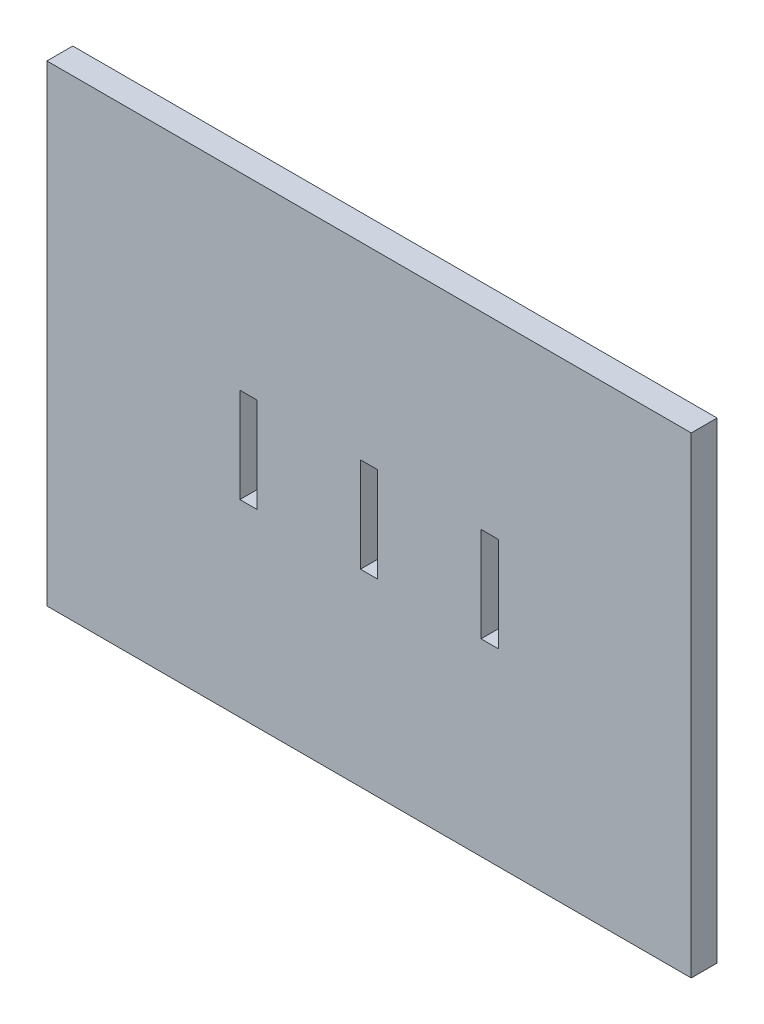
ISO-10303-21;
HEADER;
FILE_DESCRIPTION(('STEP AP214'),'2;1');
FILE_NAME('part.step','',(''),(''),'','','');
FILE_SCHEMA(('AUTOMOTIVE_DESIGN { 1 0 10303 214 1 1 1 1 }'));
ENDSEC;
DATA;
#1=APPLICATION_CONTEXT('core data for automotive mechanical design processes');
#2=APPLICATION_PROTOCOL_DEFINITION('international standard','automotive_design',2000,#1);
#3=PRODUCT_CONTEXT('',#1,'mechanical');
#4=PRODUCT('Part','Part','',(#3));
#5=PRODUCT_RELATED_PRODUCT_CATEGORY('part','',(#4));
#6=PRODUCT_DEFINITION_FORMATION('','',#4);
#7=PRODUCT_DEFINITION_CONTEXT('part definition',#1,'design');
#8=PRODUCT_DEFINITION('design','',#6,#7);
#9=PRODUCT_DEFINITION_SHAPE('','',#8);
#10=(LENGTH_UNIT() NAMED_UNIT(*) SI_UNIT(.MILLI.,.METRE.));
#11=(NAMED_UNIT(*) PLANE_ANGLE_UNIT() SI_UNIT($,.RADIAN.));
#12=(NAMED_UNIT(*) SI_UNIT($,.STERADIAN.) SOLID_ANGLE_UNIT());
#13=UNCERTAINTY_MEASURE_WITH_UNIT(LENGTH_MEASURE(1.E-05),#10,'distance_accuracy_value','');
#14=(GEOMETRIC_REPRESENTATION_CONTEXT(3) GLOBAL_UNCERTAINTY_ASSIGNED_CONTEXT((#13)) GLOBAL_UNIT_ASSIGNED_CONTEXT((#10,
#11,#12)) REPRESENTATION_CONTEXT('',''));
#15=CARTESIAN_POINT('',(0.,0.,0.));
#16=DIRECTION('',(0.,0.,1.));
#17=DIRECTION('',(1.,0.,0.));
#18=AXIS2_PLACEMENT_3D('',#15,#16,#17);
#19=CARTESIAN_POINT('',(7.50000000000001,0.,1.5));
#20=DIRECTION('',(-1.,0.,0.));
#21=DIRECTION('',(0.,0.,1.));
#22=AXIS2_PLACEMENT_3D('',#19,#20,#21);
#23=PLANE('',#22);
#24=DIRECTION('',(0.,1.,0.));
#25=VECTOR('',#24,1.);
#26=CARTESIAN_POINT('',(7.50000000000001,0.,0.));
#27=LINE('',#26,#25);
#28=CARTESIAN_POINT('',(7.50000000000001,-2.75,0.));
#29=VERTEX_POINT('',#28);
#30=CARTESIAN_POINT('',(7.50000000000001,2.75,0.));
#31=VERTEX_POINT('',#30);
#32=EDGE_CURVE('E258',#29,#31,#27,.T.);
#33=ORIENTED_EDGE('',*,*,#32,.F.);
#34=DIRECTION('',(0.,0.,-1.));
#35=VECTOR('',#34,1.);
#36=CARTESIAN_POINT('',(7.50000000000001,-2.75,1.5));
#37=LINE('',#36,#35);
#38=CARTESIAN_POINT('',(7.50000000000001,-2.75,1.5));
#39=VERTEX_POINT('',#38);
#40=EDGE_CURVE('E11',#39,#29,#37,.T.);
#41=ORIENTED_EDGE('',*,*,#40,.F.);
#42=DIRECTION('',(0.,1.,0.));
#43=VECTOR('',#42,1.);
#44=CARTESIAN_POINT('',(7.50000000000001,0.,1.5));
#45=LINE('',#44,#43);
#46=CARTESIAN_POINT('',(7.50000000000001,2.75,1.5));
#47=VERTEX_POINT('',#46);
#48=EDGE_CURVE('E174',#39,#47,#45,.T.);
#49=ORIENTED_EDGE('',*,*,#48,.T.);
#50=DIRECTION('',(0.,0.,-1.));
#51=VECTOR('',#50,1.);
#52=CARTESIAN_POINT('',(7.50000000000001,2.75,1.5));
#53=LINE('',#52,#51);
#54=EDGE_CURVE('E60',#47,#31,#53,.T.);
#55=ORIENTED_EDGE('',*,*,#54,.T.);
#56=EDGE_LOOP('',(#33,#41,#49,#55));
#57=FACE_BOUND('',#56,.T.);
#58=ADVANCED_FACE('F41',(#57),#23,.T.);
#59=CARTESIAN_POINT('',(0.,-2.75,1.5));
#60=DIRECTION('',(0.,-1.,0.));
#61=DIRECTION('',(0.,0.,-1.));
#62=AXIS2_PLACEMENT_3D('',#59,#60,#61);
#63=PLANE('',#62);
#64=DIRECTION('',(-1.,0.,0.));
#65=VECTOR('',#64,1.);
#66=CARTESIAN_POINT('',(0.,-2.75,0.));
#67=LINE('',#66,#65);
#68=CARTESIAN_POINT('',(6.50000000000001,-2.75,0.));
#69=VERTEX_POINT('',#68);
#70=EDGE_CURVE('E179',#29,#69,#67,.T.);
#71=ORIENTED_EDGE('',*,*,#70,.T.);
#72=DIRECTION('',(0.,0.,-1.));
#73=VECTOR('',#72,1.);
#74=CARTESIAN_POINT('',(6.50000000000001,-2.75,1.5));
#75=LINE('',#74,#73);
#76=CARTESIAN_POINT('',(6.50000000000001,-2.75,1.5));
#77=VERTEX_POINT('',#76);
#78=EDGE_CURVE('E51',#77,#69,#75,.T.);
#79=ORIENTED_EDGE('',*,*,#78,.F.);
#80=DIRECTION('',(-1.,0.,0.));
#81=VECTOR('',#80,1.);
#82=CARTESIAN_POINT('',(0.,-2.75,1.5));
#83=LINE('',#82,#81);
#84=EDGE_CURVE('E169',#39,#77,#83,.T.);
#85=ORIENTED_EDGE('',*,*,#84,.F.);
#86=ORIENTED_EDGE('',*,*,#40,.T.);
#87=EDGE_LOOP('',(#71,#79,#85,#86));
#88=FACE_BOUND('',#87,.T.);
#89=ADVANCED_FACE('F177',(#88),#63,.F.);
#90=CARTESIAN_POINT('',(6.50000000000001,0.,1.5));
#91=DIRECTION('',(-1.,0.,0.));
#92=DIRECTION('',(0.,0.,1.));
#93=AXIS2_PLACEMENT_3D('',#90,#91,#92);
#94=PLANE('',#93);
#95=DIRECTION('',(0.,1.,0.));
#96=VECTOR('',#95,1.);
#97=CARTESIAN_POINT('',(6.50000000000001,0.,0.));
#98=LINE('',#97,#96);
#99=CARTESIAN_POINT('',(6.50000000000001,2.75,0.));
#100=VERTEX_POINT('',#99);
#101=EDGE_CURVE('E261',#69,#100,#98,.T.);
#102=ORIENTED_EDGE('',*,*,#101,.T.);
#103=DIRECTION('',(0.,0.,-1.));
#104=VECTOR('',#103,1.);
#105=CARTESIAN_POINT('',(6.50000000000001,2.75,1.5));
#106=LINE('',#105,#104);
#107=CARTESIAN_POINT('',(6.50000000000001,2.75,1.5));
#108=VERTEX_POINT('',#107);
#109=EDGE_CURVE('E110',#108,#100,#106,.T.);
#110=ORIENTED_EDGE('',*,*,#109,.F.);
#111=DIRECTION('',(0.,1.,0.));
#112=VECTOR('',#111,1.);
#113=CARTESIAN_POINT('',(6.50000000000001,0.,1.5));
#114=LINE('',#113,#112);
#115=EDGE_CURVE('E161',#77,#108,#114,.T.);
#116=ORIENTED_EDGE('',*,*,#115,.F.);
#117=ORIENTED_EDGE('',*,*,#78,.T.);
#118=EDGE_LOOP('',(#102,#110,#116,#117));
#119=FACE_BOUND('',#118,.T.);
#120=ADVANCED_FACE('F163',(#119),#94,.F.);
#121=CARTESIAN_POINT('',(-6.49999999999999,0.,1.5));
#122=DIRECTION('',(-1.,0.,0.));
#123=DIRECTION('',(0.,0.,1.));
#124=AXIS2_PLACEMENT_3D('',#121,#122,#123);
#125=PLANE('',#124);
#126=DIRECTION('',(0.,1.,0.));
#127=VECTOR('',#126,1.);
#128=CARTESIAN_POINT('',(-6.49999999999999,0.,0.));
#129=LINE('',#128,#127);
#130=CARTESIAN_POINT('',(-6.49999999999999,-2.75,0.));
#131=VERTEX_POINT('',#130);
#132=CARTESIAN_POINT('',(-6.49999999999999,2.75,0.));
#133=VERTEX_POINT('',#132);
#134=EDGE_CURVE('E246',#131,#133,#129,.T.);
#135=ORIENTED_EDGE('',*,*,#134,.F.);
#136=DIRECTION('',(0.,0.,-1.));
#137=VECTOR('',#136,1.);
#138=CARTESIAN_POINT('',(-6.49999999999999,-2.75,1.5));
#139=LINE('',#138,#137);
#140=CARTESIAN_POINT('',(-6.49999999999999,-2.75,1.5));
#141=VERTEX_POINT('',#140);
#142=EDGE_CURVE('E192',#141,#131,#139,.T.);
#143=ORIENTED_EDGE('',*,*,#142,.F.);
#144=DIRECTION('',(0.,1.,0.));
#145=VECTOR('',#144,1.);
#146=CARTESIAN_POINT('',(-6.49999999999999,0.,1.5));
#147=LINE('',#146,#145);
#148=CARTESIAN_POINT('',(-6.49999999999999,2.75,1.5));
#149=VERTEX_POINT('',#148);
#150=EDGE_CURVE('E285',#141,#149,#147,.T.);
#151=ORIENTED_EDGE('',*,*,#150,.T.);
#152=DIRECTION('',(0.,0.,-1.));
#153=VECTOR('',#152,1.);
#154=CARTESIAN_POINT('',(-6.49999999999999,2.75,1.5));
#155=LINE('',#154,#153);
#156=EDGE_CURVE('E184',#149,#133,#155,.T.);
#157=ORIENTED_EDGE('',*,*,#156,.T.);
#158=EDGE_LOOP('',(#135,#143,#151,#157));
#159=FACE_BOUND('',#158,.T.);
#160=ADVANCED_FACE('F331',(#159),#125,.T.);
#161=CARTESIAN_POINT('',(0.,-2.75,1.5));
#162=DIRECTION('',(0.,-1.,0.));
#163=DIRECTION('',(0.,0.,-1.));
#164=AXIS2_PLACEMENT_3D('',#161,#162,#163);
#165=PLANE('',#164);
#166=DIRECTION('',(-1.,0.,0.));
#167=VECTOR('',#166,1.);
#168=CARTESIAN_POINT('',(0.,-2.75,0.));
#169=LINE('',#168,#167);
#170=CARTESIAN_POINT('',(-7.49999999999999,-2.75,0.));
#171=VERTEX_POINT('',#170);
#172=EDGE_CURVE('E249',#131,#171,#169,.T.);
#173=ORIENTED_EDGE('',*,*,#172,.T.);
#174=DIRECTION('',(0.,0.,-1.));
#175=VECTOR('',#174,1.);
#176=CARTESIAN_POINT('',(-7.49999999999999,-2.75,1.5));
#177=LINE('',#176,#175);
#178=CARTESIAN_POINT('',(-7.49999999999999,-2.75,1.5));
#179=VERTEX_POINT('',#178);
#180=EDGE_CURVE('E189',#179,#171,#177,.T.);
#181=ORIENTED_EDGE('',*,*,#180,.F.);
#182=DIRECTION('',(-1.,0.,0.));
#183=VECTOR('',#182,1.);
#184=CARTESIAN_POINT('',(0.,-2.75,1.5));
#185=LINE('',#184,#183);
#186=EDGE_CURVE('E288',#141,#179,#185,.T.);
#187=ORIENTED_EDGE('',*,*,#186,.F.);
#188=ORIENTED_EDGE('',*,*,#142,.T.);
#189=EDGE_LOOP('',(#173,#181,#187,#188));
#190=FACE_BOUND('',#189,.T.);
#191=ADVANCED_FACE('F327',(#190),#165,.F.);
#192=CARTESIAN_POINT('',(-7.49999999999999,0.,1.5));
#193=DIRECTION('',(-1.,0.,0.));
#194=DIRECTION('',(0.,0.,1.));
#195=AXIS2_PLACEMENT_3D('',#192,#193,#194);
#196=PLANE('',#195);
#197=DIRECTION('',(0.,1.,0.));
#198=VECTOR('',#197,1.);
#199=CARTESIAN_POINT('',(-7.49999999999999,0.,0.));
#200=LINE('',#199,#198);
#201=CARTESIAN_POINT('',(-7.49999999999999,2.75,0.));
#202=VERTEX_POINT('',#201);
#203=EDGE_CURVE('E252',#171,#202,#200,.T.);
#204=ORIENTED_EDGE('',*,*,#203,.T.);
#205=DIRECTION('',(0.,0.,-1.));
#206=VECTOR('',#205,1.);
#207=CARTESIAN_POINT('',(-7.49999999999999,2.75,1.5));
#208=LINE('',#207,#206);
#209=CARTESIAN_POINT('',(-7.49999999999999,2.75,1.5));
#210=VERTEX_POINT('',#209);
#211=EDGE_CURVE('E186',#210,#202,#208,.T.);
#212=ORIENTED_EDGE('',*,*,#211,.F.);
#213=DIRECTION('',(0.,1.,0.));
#214=VECTOR('',#213,1.);
#215=CARTESIAN_POINT('',(-7.49999999999999,0.,1.5));
#216=LINE('',#215,#214);
#217=EDGE_CURVE('E291',#179,#210,#216,.T.);
#218=ORIENTED_EDGE('',*,*,#217,.F.);
#219=ORIENTED_EDGE('',*,*,#180,.T.);
#220=EDGE_LOOP('',(#204,#212,#218,#219));
#221=FACE_BOUND('',#220,.T.);
#222=ADVANCED_FACE('F323',(#221),#196,.F.);
#223=CARTESIAN_POINT('',(0.,-13.7,1.5));
#224=DIRECTION('',(0.,-1.,0.));
#225=DIRECTION('',(0.,0.,-1.));
#226=AXIS2_PLACEMENT_3D('',#223,#224,#225);
#227=PLANE('',#226);
#228=DIRECTION('',(-1.,0.,0.));
#229=VECTOR('',#228,1.);
#230=CARTESIAN_POINT('',(0.,-13.7,0.));
#231=LINE('',#230,#229);
#232=CARTESIAN_POINT('',(18.7,-13.7,0.));
#233=VERTEX_POINT('',#232);
#234=CARTESIAN_POINT('',(-18.7,-13.7,0.));
#235=VERTEX_POINT('',#234);
#236=EDGE_CURVE('E234',#233,#235,#231,.T.);
#237=ORIENTED_EDGE('',*,*,#236,.F.);
#238=DIRECTION('',(0.,0.,-1.));
#239=VECTOR('',#238,1.);
#240=CARTESIAN_POINT('',(18.7,-13.7,1.5));
#241=LINE('',#240,#239);
#242=CARTESIAN_POINT('',(18.7,-13.7,1.5));
#243=VERTEX_POINT('',#242);
#244=EDGE_CURVE('E187',#243,#233,#241,.T.);
#245=ORIENTED_EDGE('',*,*,#244,.F.);
#246=DIRECTION('',(-1.,0.,0.));
#247=VECTOR('',#246,1.);
#248=CARTESIAN_POINT('',(0.,-13.7,1.5));
#249=LINE('',#248,#247);
#250=CARTESIAN_POINT('',(-18.7,-13.7,1.5));
#251=VERTEX_POINT('',#250);
#252=EDGE_CURVE('E274',#243,#251,#249,.T.);
#253=ORIENTED_EDGE('',*,*,#252,.T.);
#254=DIRECTION('',(0.,0.,-1.));
#255=VECTOR('',#254,1.);
#256=CARTESIAN_POINT('',(-18.7,-13.7,1.5));
#257=LINE('',#256,#255);
#258=EDGE_CURVE('E194',#251,#235,#257,.T.);
#259=ORIENTED_EDGE('',*,*,#258,.T.);
#260=EDGE_LOOP('',(#237,#245,#253,#259));
#261=FACE_BOUND('',#260,.T.);
#262=ADVANCED_FACE('F326',(#261),#227,.T.);
#263=CARTESIAN_POINT('',(18.7,0.,1.5));
#264=DIRECTION('',(-1.,0.,0.));
#265=DIRECTION('',(0.,0.,1.));
#266=AXIS2_PLACEMENT_3D('',#263,#264,#265);
#267=PLANE('',#266);
#268=DIRECTION('',(0.,1.,0.));
#269=VECTOR('',#268,1.);
#270=CARTESIAN_POINT('',(18.7,0.,0.));
#271=LINE('',#270,#269);
#272=CARTESIAN_POINT('',(18.7,13.7,0.));
#273=VERTEX_POINT('',#272);
#274=EDGE_CURVE('E237',#233,#273,#271,.T.);
#275=ORIENTED_EDGE('',*,*,#274,.T.);
#276=DIRECTION('',(0.,0.,-1.));
#277=VECTOR('',#276,1.);
#278=CARTESIAN_POINT('',(18.7,13.7,1.5));
#279=LINE('',#278,#277);
#280=CARTESIAN_POINT('',(18.7,13.7,1.5));
#281=VERTEX_POINT('',#280);
#282=EDGE_CURVE('E198',#281,#273,#279,.T.);
#283=ORIENTED_EDGE('',*,*,#282,.F.);
#284=DIRECTION('',(0.,1.,0.));
#285=VECTOR('',#284,1.);
#286=CARTESIAN_POINT('',(18.7,0.,1.5));
#287=LINE('',#286,#285);
#288=EDGE_CURVE('E277',#243,#281,#287,.T.);
#289=ORIENTED_EDGE('',*,*,#288,.F.);
#290=ORIENTED_EDGE('',*,*,#244,.T.);
#291=EDGE_LOOP('',(#275,#283,#289,#290));
#292=FACE_BOUND('',#291,.T.);
#293=ADVANCED_FACE('F342',(#292),#267,.F.);
#294=CARTESIAN_POINT('',(0.,13.7,1.5));
#295=DIRECTION('',(0.,-1.,0.));
#296=DIRECTION('',(0.,0.,-1.));
#297=AXIS2_PLACEMENT_3D('',#294,#295,#296);
#298=PLANE('',#297);
#299=DIRECTION('',(-1.,0.,0.));
#300=VECTOR('',#299,1.);
#301=CARTESIAN_POINT('',(0.,13.7,0.));
#302=LINE('',#301,#300);
#303=CARTESIAN_POINT('',(-18.7,13.7,0.));
#304=VERTEX_POINT('',#303);
#305=EDGE_CURVE('E240',#273,#304,#302,.T.);
#306=ORIENTED_EDGE('',*,*,#305,.T.);
#307=DIRECTION('',(0.,0.,-1.));
#308=VECTOR('',#307,1.);
#309=CARTESIAN_POINT('',(-18.7,13.7,1.5));
#310=LINE('',#309,#308);
#311=CARTESIAN_POINT('',(-18.7,13.7,1.5));
#312=VERTEX_POINT('',#311);
#313=EDGE_CURVE('E196',#312,#304,#310,.T.);
#314=ORIENTED_EDGE('',*,*,#313,.F.);
#315=DIRECTION('',(-1.,0.,0.));
#316=VECTOR('',#315,1.);
#317=CARTESIAN_POINT('',(0.,13.7,1.5));
#318=LINE('',#317,#316);
#319=EDGE_CURVE('E280',#281,#312,#318,.T.);
#320=ORIENTED_EDGE('',*,*,#319,.F.);
#321=ORIENTED_EDGE('',*,*,#282,.T.);
#322=EDGE_LOOP('',(#306,#314,#320,#321));
#323=FACE_BOUND('',#322,.T.);
#324=ADVANCED_FACE('F339',(#323),#298,.F.);
#325=CARTESIAN_POINT('',(0.,2.75,1.5));
#326=DIRECTION('',(0.,-1.,0.));
#327=DIRECTION('',(0.,0.,-1.));
#328=AXIS2_PLACEMENT_3D('',#325,#326,#327);
#329=PLANE('',#328);
#330=DIRECTION('',(-1.,0.,0.));
#331=VECTOR('',#330,1.);
#332=CARTESIAN_POINT('',(0.,2.75,0.));
#333=LINE('',#332,#331);
#334=CARTESIAN_POINT('',(0.500000000000007,2.75,0.));
#335=VERTEX_POINT('',#334);
#336=CARTESIAN_POINT('',(-0.499999999999993,2.75,0.));
#337=VERTEX_POINT('',#336);
#338=EDGE_CURVE('E219',#335,#337,#333,.T.);
#339=ORIENTED_EDGE('',*,*,#338,.F.);
#340=DIRECTION('',(0.,0.,-1.));
#341=VECTOR('',#340,1.);
#342=CARTESIAN_POINT('',(0.500000000000007,2.75,1.5));
#343=LINE('',#342,#341);
#344=CARTESIAN_POINT('',(0.500000000000007,2.75,1.5));
#345=VERTEX_POINT('',#344);
#346=EDGE_CURVE('E45',#345,#335,#343,.T.);
#347=ORIENTED_EDGE('',*,*,#346,.F.);
#348=DIRECTION('',(-1.,0.,0.));
#349=VECTOR('',#348,1.);
#350=CARTESIAN_POINT('',(0.,2.75,1.5));
#351=LINE('',#350,#349);
#352=CARTESIAN_POINT('',(-0.499999999999993,2.75,1.5));
#353=VERTEX_POINT('',#352);
#354=EDGE_CURVE('E265',#345,#353,#351,.T.);
#355=ORIENTED_EDGE('',*,*,#354,.T.);
#356=DIRECTION('',(0.,0.,-1.));
#357=VECTOR('',#356,1.);
#358=CARTESIAN_POINT('',(-0.499999999999993,2.75,1.5));
#359=LINE('',#358,#357);
#360=EDGE_CURVE('E202',#353,#337,#359,.T.);
#361=ORIENTED_EDGE('',*,*,#360,.T.);
#362=EDGE_LOOP('',(#339,#347,#355,#361));
#363=FACE_BOUND('',#362,.T.);
#364=ADVANCED_FACE('F43',(#363),#329,.T.);
#365=CARTESIAN_POINT('',(0.500000000000007,0.,1.5));
#366=DIRECTION('',(-1.,0.,0.));
#367=DIRECTION('',(0.,0.,1.));
#368=AXIS2_PLACEMENT_3D('',#365,#366,#367);
#369=PLANE('',#368);
#370=DIRECTION('',(0.,1.,0.));
#371=VECTOR('',#370,1.);
#372=CARTESIAN_POINT('',(0.500000000000007,0.,0.));
#373=LINE('',#372,#371);
#374=CARTESIAN_POINT('',(0.500000000000007,-2.75,0.));
#375=VERTEX_POINT('',#374);
#376=EDGE_CURVE('E215',#375,#335,#373,.T.);
#377=ORIENTED_EDGE('',*,*,#376,.F.);
#378=DIRECTION('',(0.,0.,-1.));
#379=VECTOR('',#378,1.);
#380=CARTESIAN_POINT('',(0.500000000000007,-2.75,1.5));
#381=LINE('',#380,#379);
#382=CARTESIAN_POINT('',(0.500000000000007,-2.75,1.5));
#383=VERTEX_POINT('',#382);
#384=EDGE_CURVE('E206',#383,#375,#381,.T.);
#385=ORIENTED_EDGE('',*,*,#384,.F.);
#386=DIRECTION('',(0.,1.,0.));
#387=VECTOR('',#386,1.);
#388=CARTESIAN_POINT('',(0.500000000000007,0.,1.5));
#389=LINE('',#388,#387);
#390=EDGE_CURVE('E217',#383,#345,#389,.T.);
#391=ORIENTED_EDGE('',*,*,#390,.T.);
#392=ORIENTED_EDGE('',*,*,#346,.T.);
#393=EDGE_LOOP('',(#377,#385,#391,#392));
#394=FACE_BOUND('',#393,.T.);
#395=ADVANCED_FACE('F213',(#394),#369,.T.);
#396=CARTESIAN_POINT('',(0.,-2.75,1.5));
#397=DIRECTION('',(0.,-1.,0.));
#398=DIRECTION('',(0.,0.,-1.));
#399=AXIS2_PLACEMENT_3D('',#396,#397,#398);
#400=PLANE('',#399);
#401=DIRECTION('',(-1.,0.,0.));
#402=VECTOR('',#401,1.);
#403=CARTESIAN_POINT('',(0.,-2.75,0.));
#404=LINE('',#403,#402);
#405=CARTESIAN_POINT('',(-0.499999999999993,-2.75,0.));
#406=VERTEX_POINT('',#405);
#407=EDGE_CURVE('E227',#375,#406,#404,.T.);
#408=ORIENTED_EDGE('',*,*,#407,.T.);
#409=DIRECTION('',(0.,0.,-1.));
#410=VECTOR('',#409,1.);
#411=CARTESIAN_POINT('',(-0.499999999999993,-2.75,1.5));
#412=LINE('',#411,#410);
#413=CARTESIAN_POINT('',(-0.499999999999993,-2.75,1.5));
#414=VERTEX_POINT('',#413);
#415=EDGE_CURVE('E204',#414,#406,#412,.T.);
#416=ORIENTED_EDGE('',*,*,#415,.F.);
#417=DIRECTION('',(-1.,0.,0.));
#418=VECTOR('',#417,1.);
#419=CARTESIAN_POINT('',(0.,-2.75,1.5));
#420=LINE('',#419,#418);
#421=EDGE_CURVE('E268',#383,#414,#420,.T.);
#422=ORIENTED_EDGE('',*,*,#421,.F.);
#423=ORIENTED_EDGE('',*,*,#384,.T.);
#424=EDGE_LOOP('',(#408,#416,#422,#423));
#425=FACE_BOUND('',#424,.T.);
#426=ADVANCED_FACE('F321',(#425),#400,.F.);
#427=CARTESIAN_POINT('',(0.,2.75,1.5));
#428=DIRECTION('',(0.,-1.,0.));
#429=DIRECTION('',(0.,0.,-1.));
#430=AXIS2_PLACEMENT_3D('',#427,#428,#429);
#431=PLANE('',#430);
#432=DIRECTION('',(-1.,0.,0.));
#433=VECTOR('',#432,1.);
#434=CARTESIAN_POINT('',(0.,2.75,0.));
#435=LINE('',#434,#433);
#436=EDGE_CURVE('E255',#133,#202,#435,.T.);
#437=ORIENTED_EDGE('',*,*,#436,.F.);
#438=ORIENTED_EDGE('',*,*,#156,.F.);
#439=DIRECTION('',(-1.,0.,0.));
#440=VECTOR('',#439,1.);
#441=CARTESIAN_POINT('',(0.,2.75,1.5));
#442=LINE('',#441,#440);
#443=EDGE_CURVE('E293',#149,#210,#442,.T.);
#444=ORIENTED_EDGE('',*,*,#443,.T.);
#445=ORIENTED_EDGE('',*,*,#211,.T.);
#446=EDGE_LOOP('',(#437,#438,#444,#445));
#447=FACE_BOUND('',#446,.T.);
#448=ADVANCED_FACE('F318',(#447),#431,.T.);
#449=CARTESIAN_POINT('',(-18.7,0.,1.5));
#450=DIRECTION('',(-1.,0.,0.));
#451=DIRECTION('',(0.,-1.,0.));
#452=AXIS2_PLACEMENT_3D('',#449,#450,#451);
#453=PLANE('',#452);
#454=DIRECTION('',(0.,1.,0.));
#455=VECTOR('',#454,1.);
#456=CARTESIAN_POINT('',(-18.7,0.,0.));
#457=LINE('',#456,#455);
#458=EDGE_CURVE('E243',#235,#304,#457,.T.);
#459=ORIENTED_EDGE('',*,*,#458,.F.);
#460=ORIENTED_EDGE('',*,*,#258,.F.);
#461=DIRECTION('',(0.,1.,0.));
#462=VECTOR('',#461,1.);
#463=CARTESIAN_POINT('',(-18.7,0.,1.5));
#464=LINE('',#463,#462);
#465=EDGE_CURVE('E282',#251,#312,#464,.T.);
#466=ORIENTED_EDGE('',*,*,#465,.T.);
#467=ORIENTED_EDGE('',*,*,#313,.T.);
#468=EDGE_LOOP('',(#459,#460,#466,#467));
#469=FACE_BOUND('',#468,.T.);
#470=ADVANCED_FACE('F306',(#469),#453,.T.);
#471=CARTESIAN_POINT('',(-0.499999999999993,0.,1.5));
#472=DIRECTION('',(-1.,0.,0.));
#473=DIRECTION('',(0.,0.,1.));
#474=AXIS2_PLACEMENT_3D('',#471,#472,#473);
#475=PLANE('',#474);
#476=DIRECTION('',(0.,1.,0.));
#477=VECTOR('',#476,1.);
#478=CARTESIAN_POINT('',(-0.499999999999993,0.,0.));
#479=LINE('',#478,#477);
#480=EDGE_CURVE('E229',#406,#337,#479,.T.);
#481=ORIENTED_EDGE('',*,*,#480,.T.);
#482=ORIENTED_EDGE('',*,*,#360,.F.);
#483=DIRECTION('',(0.,1.,0.));
#484=VECTOR('',#483,1.);
#485=CARTESIAN_POINT('',(-0.499999999999993,0.,1.5));
#486=LINE('',#485,#484);
#487=EDGE_CURVE('E272',#414,#353,#486,.T.);
#488=ORIENTED_EDGE('',*,*,#487,.F.);
#489=ORIENTED_EDGE('',*,*,#415,.T.);
#490=EDGE_LOOP('',(#481,#482,#488,#489));
#491=FACE_BOUND('',#490,.T.);
#492=ADVANCED_FACE('F298',(#491),#475,.F.);
#493=CARTESIAN_POINT('',(0.,2.75,1.5));
#494=DIRECTION('',(0.,-1.,0.));
#495=DIRECTION('',(0.,0.,-1.));
#496=AXIS2_PLACEMENT_3D('',#493,#494,#495);
#497=PLANE('',#496);
#498=DIRECTION('',(-1.,0.,0.));
#499=VECTOR('',#498,1.);
#500=CARTESIAN_POINT('',(0.,2.75,0.));
#501=LINE('',#500,#499);
#502=EDGE_CURVE('E263',#31,#100,#501,.T.);
#503=ORIENTED_EDGE('',*,*,#502,.F.);
#504=ORIENTED_EDGE('',*,*,#54,.F.);
#505=DIRECTION('',(-1.,0.,0.));
#506=VECTOR('',#505,1.);
#507=CARTESIAN_POINT('',(0.,2.75,1.5));
#508=LINE('',#507,#506);
#509=EDGE_CURVE('E168',#47,#108,#508,.T.);
#510=ORIENTED_EDGE('',*,*,#509,.T.);
#511=ORIENTED_EDGE('',*,*,#109,.T.);
#512=EDGE_LOOP('',(#503,#504,#510,#511));
#513=FACE_BOUND('',#512,.T.);
#514=ADVANCED_FACE('F296',(#513),#497,.T.);
#515=CARTESIAN_POINT('',(0.,0.,1.5));
#516=DIRECTION('',(0.,0.,1.));
#517=DIRECTION('',(1.,0.,0.));
#518=AXIS2_PLACEMENT_3D('',#515,#516,#517);
#519=PLANE('',#518);
#520=ORIENTED_EDGE('',*,*,#354,.F.);
#521=ORIENTED_EDGE('',*,*,#390,.F.);
#522=ORIENTED_EDGE('',*,*,#421,.T.);
#523=ORIENTED_EDGE('',*,*,#487,.T.);
#524=EDGE_LOOP('',(#520,#521,#522,#523));
#525=FACE_BOUND('',#524,.T.);
#526=ORIENTED_EDGE('',*,*,#252,.F.);
#527=ORIENTED_EDGE('',*,*,#288,.T.);
#528=ORIENTED_EDGE('',*,*,#319,.T.);
#529=ORIENTED_EDGE('',*,*,#465,.F.);
#530=EDGE_LOOP('',(#526,#527,#528,#529));
#531=FACE_BOUND('',#530,.T.);
#532=ORIENTED_EDGE('',*,*,#150,.F.);
#533=ORIENTED_EDGE('',*,*,#186,.T.);
#534=ORIENTED_EDGE('',*,*,#217,.T.);
#535=ORIENTED_EDGE('',*,*,#443,.F.);
#536=EDGE_LOOP('',(#532,#533,#534,#535));
#537=FACE_BOUND('',#536,.T.);
#538=ORIENTED_EDGE('',*,*,#48,.F.);
#539=ORIENTED_EDGE('',*,*,#84,.T.);
#540=ORIENTED_EDGE('',*,*,#115,.T.);
#541=ORIENTED_EDGE('',*,*,#509,.F.);
#542=EDGE_LOOP('',(#538,#539,#540,#541));
#543=FACE_BOUND('',#542,.T.);
#544=ADVANCED_FACE('F173',(#525,#531,#537,#543),#519,.T.);
#545=CARTESIAN_POINT('',(0.,0.,0.));
#546=DIRECTION('',(0.,0.,1.));
#547=DIRECTION('',(1.,0.,0.));
#548=AXIS2_PLACEMENT_3D('',#545,#546,#547);
#549=PLANE('',#548);
#550=ORIENTED_EDGE('',*,*,#338,.T.);
#551=ORIENTED_EDGE('',*,*,#480,.F.);
#552=ORIENTED_EDGE('',*,*,#407,.F.);
#553=ORIENTED_EDGE('',*,*,#376,.T.);
#554=EDGE_LOOP('',(#550,#551,#552,#553));
#555=FACE_BOUND('',#554,.T.);
#556=ORIENTED_EDGE('',*,*,#236,.T.);
#557=ORIENTED_EDGE('',*,*,#458,.T.);
#558=ORIENTED_EDGE('',*,*,#305,.F.);
#559=ORIENTED_EDGE('',*,*,#274,.F.);
#560=EDGE_LOOP('',(#556,#557,#558,#559));
#561=FACE_BOUND('',#560,.T.);
#562=ORIENTED_EDGE('',*,*,#134,.T.);
#563=ORIENTED_EDGE('',*,*,#436,.T.);
#564=ORIENTED_EDGE('',*,*,#203,.F.);
#565=ORIENTED_EDGE('',*,*,#172,.F.);
#566=EDGE_LOOP('',(#562,#563,#564,#565));
#567=FACE_BOUND('',#566,.T.);
#568=ORIENTED_EDGE('',*,*,#32,.T.);
#569=ORIENTED_EDGE('',*,*,#502,.T.);
#570=ORIENTED_EDGE('',*,*,#101,.F.);
#571=ORIENTED_EDGE('',*,*,#70,.F.);
#572=EDGE_LOOP('',(#568,#569,#570,#571));
#573=FACE_BOUND('',#572,.T.);
#574=ADVANCED_FACE('F225',(#555,#561,#567,#573),#549,.F.);
#575=CLOSED_SHELL('',(#58,#89,#120,#160,#191,#222,#262,#293,#324,#364,#395,#426,#448,#470,#492,
#514,#544,#574));
#576=MANIFOLD_SOLID_BREP('B2',#575);
#577=ADVANCED_BREP_SHAPE_REPRESENTATION('',(#18,#576),#14);
#578=SHAPE_DEFINITION_REPRESENTATION(#9,#577);
ENDSEC;
END-ISO-10303-21;
